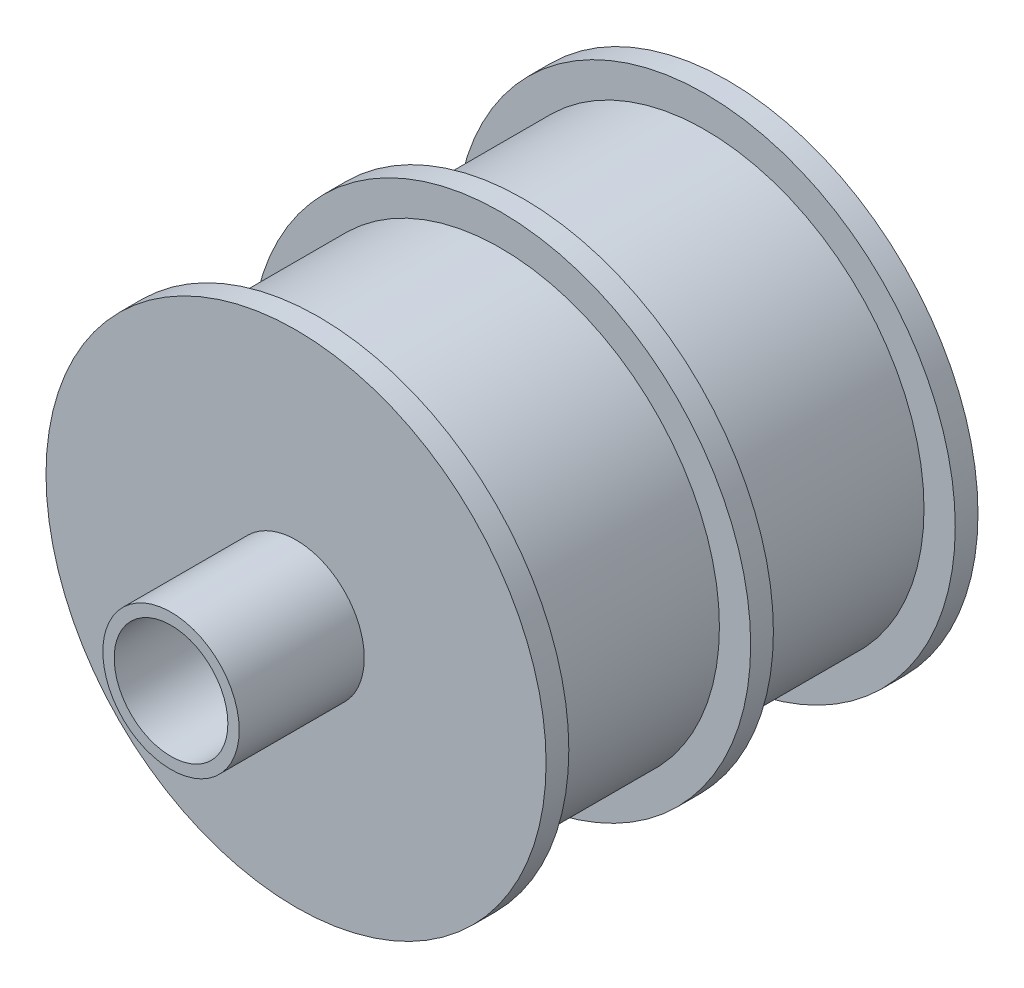
ISO-10303-21;
HEADER;
FILE_DESCRIPTION(('STEP AP214'),'2;1');
FILE_NAME('part.step','',(''),(''),'','','');
FILE_SCHEMA(('AUTOMOTIVE_DESIGN { 1 0 10303 214 1 1 1 1 }'));
ENDSEC;
DATA;
#1=APPLICATION_CONTEXT('core data for automotive mechanical design processes');
#2=APPLICATION_PROTOCOL_DEFINITION('international standard','automotive_design',2000,#1);
#3=PRODUCT_CONTEXT('',#1,'mechanical');
#4=PRODUCT('Part','Part','',(#3));
#5=PRODUCT_RELATED_PRODUCT_CATEGORY('part','',(#4));
#6=PRODUCT_DEFINITION_FORMATION('','',#4);
#7=PRODUCT_DEFINITION_CONTEXT('part definition',#1,'design');
#8=PRODUCT_DEFINITION('design','',#6,#7);
#9=PRODUCT_DEFINITION_SHAPE('','',#8);
#10=(LENGTH_UNIT() NAMED_UNIT(*) SI_UNIT(.MILLI.,.METRE.));
#11=(NAMED_UNIT(*) PLANE_ANGLE_UNIT() SI_UNIT($,.RADIAN.));
#12=(NAMED_UNIT(*) SI_UNIT($,.STERADIAN.) SOLID_ANGLE_UNIT());
#13=UNCERTAINTY_MEASURE_WITH_UNIT(LENGTH_MEASURE(1.E-05),#10,'distance_accuracy_value','');
#14=(GEOMETRIC_REPRESENTATION_CONTEXT(3) GLOBAL_UNCERTAINTY_ASSIGNED_CONTEXT((#13)) GLOBAL_UNIT_ASSIGNED_CONTEXT((#10,
#11,#12)) REPRESENTATION_CONTEXT('',''));
#15=CARTESIAN_POINT('',(0.,0.,0.));
#16=DIRECTION('',(0.,0.,1.));
#17=DIRECTION('',(1.,0.,0.));
#18=AXIS2_PLACEMENT_3D('',#15,#16,#17);
#19=CARTESIAN_POINT('',(0.,0.,49.));
#20=DIRECTION('',(0.,0.,1.));
#21=DIRECTION('',(1.,0.,0.));
#22=AXIS2_PLACEMENT_3D('',#19,#20,#21);
#23=PLANE('',#22);
#24=CARTESIAN_POINT('',(0.,0.,49.));
#25=DIRECTION('',(0.,0.,1.));
#26=DIRECTION('',(1.,0.,0.));
#27=AXIS2_PLACEMENT_3D('',#24,#25,#26);
#28=CIRCLE('',#27,5.);
#29=CARTESIAN_POINT('',(5.,0.,49.));
#30=VERTEX_POINT('',#29);
#31=EDGE_CURVE('P0_E20',#30,#30,#28,.T.);
#32=ORIENTED_EDGE('',*,*,#31,.F.);
#33=EDGE_LOOP('',(#32));
#34=FACE_BOUND('',#33,.T.);
#35=CARTESIAN_POINT('',(0.,0.,49.));
#36=DIRECTION('',(0.,0.,-1.));
#37=DIRECTION('',(1.,0.,0.));
#38=AXIS2_PLACEMENT_3D('',#35,#36,#37);
#39=CIRCLE('',#38,6.);
#40=CARTESIAN_POINT('',(6.,0.,49.));
#41=VERTEX_POINT('',#40);
#42=EDGE_CURVE('P0_E27',#41,#41,#39,.T.);
#43=ORIENTED_EDGE('',*,*,#42,.F.);
#44=EDGE_LOOP('',(#43));
#45=FACE_BOUND('',#44,.T.);
#46=ADVANCED_FACE('P0_F16',(#34,#45),#23,.T.);
#47=CARTESIAN_POINT('',(0.,0.,-11.));
#48=DIRECTION('',(0.,0.,-1.));
#49=DIRECTION('',(0.,-1.,0.));
#50=AXIS2_PLACEMENT_3D('',#47,#48,#49);
#51=PLANE('',#50);
#52=CARTESIAN_POINT('',(0.,0.,-11.));
#53=DIRECTION('',(0.,0.,1.));
#54=DIRECTION('',(1.,0.,0.));
#55=AXIS2_PLACEMENT_3D('',#52,#53,#54);
#56=CIRCLE('',#55,5.);
#57=CARTESIAN_POINT('',(5.,0.,-11.));
#58=VERTEX_POINT('',#57);
#59=EDGE_CURVE('P0_E11',#58,#58,#56,.T.);
#60=ORIENTED_EDGE('',*,*,#59,.T.);
#61=EDGE_LOOP('',(#60));
#62=FACE_BOUND('',#61,.T.);
#63=CARTESIAN_POINT('',(0.,0.,-11.));
#64=DIRECTION('',(0.,0.,1.));
#65=DIRECTION('',(1.,0.,0.));
#66=AXIS2_PLACEMENT_3D('',#63,#64,#65);
#67=CIRCLE('',#66,6.);
#68=CARTESIAN_POINT('',(6.,0.,-11.));
#69=VERTEX_POINT('',#68);
#70=EDGE_CURVE('P0_E48',#69,#69,#67,.T.);
#71=ORIENTED_EDGE('',*,*,#70,.F.);
#72=EDGE_LOOP('',(#71));
#73=FACE_BOUND('',#72,.T.);
#74=ADVANCED_FACE('P0_F49',(#62,#73),#51,.T.);
#75=CARTESIAN_POINT('',(0.,0.,-11.));
#76=DIRECTION('',(0.,0.,1.));
#77=DIRECTION('',(1.,0.,0.));
#78=AXIS2_PLACEMENT_3D('',#75,#76,#77);
#79=CYLINDRICAL_SURFACE('',#78,6.);
#80=ORIENTED_EDGE('',*,*,#42,.T.);
#81=EDGE_LOOP('',(#80));
#82=FACE_BOUND('',#81,.T.);
#83=ORIENTED_EDGE('',*,*,#70,.T.);
#84=EDGE_LOOP('',(#83));
#85=FACE_BOUND('',#84,.T.);
#86=ADVANCED_FACE('P0_F18',(#82,#85),#79,.T.);
#87=CARTESIAN_POINT('',(0.,0.,-11.));
#88=DIRECTION('',(0.,0.,1.));
#89=DIRECTION('',(1.,0.,0.));
#90=AXIS2_PLACEMENT_3D('',#87,#88,#89);
#91=CYLINDRICAL_SURFACE('',#90,5.);
#92=ORIENTED_EDGE('',*,*,#31,.T.);
#93=EDGE_LOOP('',(#92));
#94=FACE_BOUND('',#93,.T.);
#95=ORIENTED_EDGE('',*,*,#59,.F.);
#96=EDGE_LOOP('',(#95));
#97=FACE_BOUND('',#96,.T.);
#98=ADVANCED_FACE('P0_F63',(#94,#97),#91,.F.);
#99=CLOSED_SHELL('',(#46,#74,#86,#98));
#100=MANIFOLD_SOLID_BREP('P0_B1',#99);
#101=CARTESIAN_POINT('',(0.,0.,0.));
#102=DIRECTION('',(0.,0.,1.));
#103=DIRECTION('',(1.,0.,0.));
#104=AXIS2_PLACEMENT_3D('',#101,#102,#103);
#105=CYLINDRICAL_SURFACE('',#104,22.);
#106=CARTESIAN_POINT('',(0.,0.,38.));
#107=DIRECTION('',(0.,0.,-1.));
#108=DIRECTION('',(1.,0.,0.));
#109=AXIS2_PLACEMENT_3D('',#106,#107,#108);
#110=CIRCLE('',#109,22.);
#111=CARTESIAN_POINT('',(22.,0.,38.));
#112=VERTEX_POINT('',#111);
#113=EDGE_CURVE('P1_E11',#112,#112,#110,.T.);
#114=ORIENTED_EDGE('',*,*,#113,.T.);
#115=EDGE_LOOP('',(#114));
#116=FACE_BOUND('',#115,.T.);
#117=CARTESIAN_POINT('',(0.,0.,36.));
#118=DIRECTION('',(0.,0.,-1.));
#119=DIRECTION('',(1.,0.,0.));
#120=AXIS2_PLACEMENT_3D('',#117,#118,#119);
#121=CIRCLE('',#120,22.);
#122=CARTESIAN_POINT('',(22.,0.,36.));
#123=VERTEX_POINT('',#122);
#124=EDGE_CURVE('P1_E112',#123,#123,#121,.T.);
#125=ORIENTED_EDGE('',*,*,#124,.F.);
#126=EDGE_LOOP('',(#125));
#127=FACE_BOUND('',#126,.T.);
#128=ADVANCED_FACE('P1_F16',(#116,#127),#105,.T.);
#129=CARTESIAN_POINT('',(0.,0.,0.));
#130=DIRECTION('',(0.,0.,1.));
#131=DIRECTION('',(1.,0.,0.));
#132=AXIS2_PLACEMENT_3D('',#129,#130,#131);
#133=CYLINDRICAL_SURFACE('',#132,22.);
#134=CARTESIAN_POINT('',(0.,0.,20.));
#135=DIRECTION('',(0.,0.,-1.));
#136=DIRECTION('',(1.,0.,0.));
#137=AXIS2_PLACEMENT_3D('',#134,#135,#136);
#138=CIRCLE('',#137,22.);
#139=CARTESIAN_POINT('',(22.,0.,20.));
#140=VERTEX_POINT('',#139);
#141=EDGE_CURVE('P1_E26',#140,#140,#138,.T.);
#142=ORIENTED_EDGE('',*,*,#141,.T.);
#143=EDGE_LOOP('',(#142));
#144=FACE_BOUND('',#143,.T.);
#145=CARTESIAN_POINT('',(0.,0.,18.));
#146=DIRECTION('',(0.,0.,-1.));
#147=DIRECTION('',(1.,0.,0.));
#148=AXIS2_PLACEMENT_3D('',#145,#146,#147);
#149=CIRCLE('',#148,22.);
#150=CARTESIAN_POINT('',(22.,0.,18.));
#151=VERTEX_POINT('',#150);
#152=EDGE_CURVE('P1_E77',#151,#151,#149,.T.);
#153=ORIENTED_EDGE('',*,*,#152,.F.);
#154=EDGE_LOOP('',(#153));
#155=FACE_BOUND('',#154,.T.);
#156=ADVANCED_FACE('P1_F78',(#144,#155),#133,.T.);
#157=CARTESIAN_POINT('',(0.,0.,38.));
#158=DIRECTION('',(0.,0.,1.));
#159=DIRECTION('',(1.,0.,0.));
#160=AXIS2_PLACEMENT_3D('',#157,#158,#159);
#161=PLANE('',#160);
#162=CARTESIAN_POINT('',(0.,0.,38.));
#163=DIRECTION('',(0.,0.,-1.));
#164=DIRECTION('',(-1.,0.,0.));
#165=AXIS2_PLACEMENT_3D('',#162,#163,#164);
#166=CIRCLE('',#165,6.);
#167=CARTESIAN_POINT('',(-6.,0.,38.));
#168=VERTEX_POINT('',#167);
#169=EDGE_CURVE('P1_E96',#168,#168,#166,.T.);
#170=ORIENTED_EDGE('',*,*,#169,.T.);
#171=EDGE_LOOP('',(#170));
#172=FACE_BOUND('',#171,.T.);
#173=ORIENTED_EDGE('',*,*,#113,.F.);
#174=EDGE_LOOP('',(#173));
#175=FACE_BOUND('',#174,.T.);
#176=ADVANCED_FACE('P1_F138',(#172,#175),#161,.T.);
#177=CARTESIAN_POINT('',(0.,0.,0.));
#178=DIRECTION('',(0.,0.,-1.));
#179=DIRECTION('',(0.,-1.,0.));
#180=AXIS2_PLACEMENT_3D('',#177,#178,#179);
#181=PLANE('',#180);
#182=CARTESIAN_POINT('',(0.,0.,0.));
#183=DIRECTION('',(0.,0.,-1.));
#184=DIRECTION('',(-1.,0.,0.));
#185=AXIS2_PLACEMENT_3D('',#182,#183,#184);
#186=CIRCLE('',#185,6.);
#187=CARTESIAN_POINT('',(-6.,0.,0.));
#188=VERTEX_POINT('',#187);
#189=EDGE_CURVE('P1_E90',#188,#188,#186,.T.);
#190=ORIENTED_EDGE('',*,*,#189,.F.);
#191=EDGE_LOOP('',(#190));
#192=FACE_BOUND('',#191,.T.);
#193=CARTESIAN_POINT('',(0.,0.,0.));
#194=DIRECTION('',(0.,0.,1.));
#195=DIRECTION('',(1.,0.,0.));
#196=AXIS2_PLACEMENT_3D('',#193,#194,#195);
#197=CIRCLE('',#196,22.);
#198=CARTESIAN_POINT('',(22.,0.,0.));
#199=VERTEX_POINT('',#198);
#200=EDGE_CURVE('P1_E101',#199,#199,#197,.T.);
#201=ORIENTED_EDGE('',*,*,#200,.F.);
#202=EDGE_LOOP('',(#201));
#203=FACE_BOUND('',#202,.T.);
#204=ADVANCED_FACE('P1_F134',(#192,#203),#181,.T.);
#205=CARTESIAN_POINT('',(0.,0.,0.));
#206=DIRECTION('',(0.,0.,1.));
#207=DIRECTION('',(1.,0.,0.));
#208=AXIS2_PLACEMENT_3D('',#205,#206,#207);
#209=CYLINDRICAL_SURFACE('',#208,22.);
#210=CARTESIAN_POINT('',(0.,0.,2.));
#211=DIRECTION('',(0.,0.,-1.));
#212=DIRECTION('',(1.,0.,0.));
#213=AXIS2_PLACEMENT_3D('',#210,#211,#212);
#214=CIRCLE('',#213,22.);
#215=CARTESIAN_POINT('',(22.,0.,2.));
#216=VERTEX_POINT('',#215);
#217=EDGE_CURVE('P1_E105',#216,#216,#214,.T.);
#218=ORIENTED_EDGE('',*,*,#217,.T.);
#219=EDGE_LOOP('',(#218));
#220=FACE_BOUND('',#219,.T.);
#221=ORIENTED_EDGE('',*,*,#200,.T.);
#222=EDGE_LOOP('',(#221));
#223=FACE_BOUND('',#222,.T.);
#224=ADVANCED_FACE('P1_F137',(#220,#223),#209,.T.);
#225=CARTESIAN_POINT('',(0.,0.,38.));
#226=DIRECTION('',(0.,0.,-1.));
#227=DIRECTION('',(-1.,0.,0.));
#228=AXIS2_PLACEMENT_3D('',#225,#226,#227);
#229=CYLINDRICAL_SURFACE('',#228,6.);
#230=ORIENTED_EDGE('',*,*,#189,.T.);
#231=EDGE_LOOP('',(#230));
#232=FACE_BOUND('',#231,.T.);
#233=ORIENTED_EDGE('',*,*,#169,.F.);
#234=EDGE_LOOP('',(#233));
#235=FACE_BOUND('',#234,.T.);
#236=ADVANCED_FACE('P1_F131',(#232,#235),#229,.F.);
#237=CARTESIAN_POINT('',(0.,0.,18.));
#238=DIRECTION('',(0.,0.,-1.));
#239=DIRECTION('',(-1.,0.,0.));
#240=AXIS2_PLACEMENT_3D('',#237,#238,#239);
#241=CYLINDRICAL_SURFACE('',#240,19.25);
#242=CARTESIAN_POINT('',(0.,0.,18.));
#243=DIRECTION('',(0.,0.,-1.));
#244=DIRECTION('',(1.,0.,0.));
#245=AXIS2_PLACEMENT_3D('',#242,#243,#244);
#246=CIRCLE('',#245,19.25);
#247=CARTESIAN_POINT('',(19.25,0.,18.));
#248=VERTEX_POINT('',#247);
#249=EDGE_CURVE('P1_E81',#248,#248,#246,.T.);
#250=ORIENTED_EDGE('',*,*,#249,.T.);
#251=EDGE_LOOP('',(#250));
#252=FACE_BOUND('',#251,.T.);
#253=CARTESIAN_POINT('',(0.,0.,2.));
#254=DIRECTION('',(0.,0.,-1.));
#255=DIRECTION('',(1.,0.,0.));
#256=AXIS2_PLACEMENT_3D('',#253,#254,#255);
#257=CIRCLE('',#256,19.25);
#258=CARTESIAN_POINT('',(19.25,0.,2.));
#259=VERTEX_POINT('',#258);
#260=EDGE_CURVE('P1_E82',#259,#259,#257,.T.);
#261=ORIENTED_EDGE('',*,*,#260,.F.);
#262=EDGE_LOOP('',(#261));
#263=FACE_BOUND('',#262,.T.);
#264=ADVANCED_FACE('P1_F148',(#252,#263),#241,.T.);
#265=CARTESIAN_POINT('',(0.,0.,18.));
#266=DIRECTION('',(0.,0.,-1.));
#267=DIRECTION('',(0.,-1.,0.));
#268=AXIS2_PLACEMENT_3D('',#265,#266,#267);
#269=PLANE('',#268);
#270=ORIENTED_EDGE('',*,*,#152,.T.);
#271=EDGE_LOOP('',(#270));
#272=FACE_BOUND('',#271,.T.);
#273=ORIENTED_EDGE('',*,*,#249,.F.);
#274=EDGE_LOOP('',(#273));
#275=FACE_BOUND('',#274,.T.);
#276=ADVANCED_FACE('P1_F165',(#272,#275),#269,.T.);
#277=CARTESIAN_POINT('',(0.,0.,2.));
#278=DIRECTION('',(0.,0.,-1.));
#279=DIRECTION('',(0.,-1.,0.));
#280=AXIS2_PLACEMENT_3D('',#277,#278,#279);
#281=PLANE('',#280);
#282=ORIENTED_EDGE('',*,*,#217,.F.);
#283=EDGE_LOOP('',(#282));
#284=FACE_BOUND('',#283,.T.);
#285=ORIENTED_EDGE('',*,*,#260,.T.);
#286=EDGE_LOOP('',(#285));
#287=FACE_BOUND('',#286,.T.);
#288=ADVANCED_FACE('P1_F162',(#284,#287),#281,.F.);
#289=CARTESIAN_POINT('',(0.,0.,20.));
#290=DIRECTION('',(0.,0.,1.));
#291=DIRECTION('',(1.,0.,0.));
#292=AXIS2_PLACEMENT_3D('',#289,#290,#291);
#293=CYLINDRICAL_SURFACE('',#292,19.25);
#294=CARTESIAN_POINT('',(0.,0.,20.));
#295=DIRECTION('',(0.,0.,-1.));
#296=DIRECTION('',(1.,0.,0.));
#297=AXIS2_PLACEMENT_3D('',#294,#295,#296);
#298=CIRCLE('',#297,19.25);
#299=CARTESIAN_POINT('',(19.25,0.,20.));
#300=VERTEX_POINT('',#299);
#301=EDGE_CURVE('P1_E109',#300,#300,#298,.T.);
#302=ORIENTED_EDGE('',*,*,#301,.F.);
#303=EDGE_LOOP('',(#302));
#304=FACE_BOUND('',#303,.T.);
#305=CARTESIAN_POINT('',(0.,0.,36.));
#306=DIRECTION('',(0.,0.,-1.));
#307=DIRECTION('',(1.,0.,0.));
#308=AXIS2_PLACEMENT_3D('',#305,#306,#307);
#309=CIRCLE('',#308,19.25);
#310=CARTESIAN_POINT('',(19.25,0.,36.));
#311=VERTEX_POINT('',#310);
#312=EDGE_CURVE('P1_E92',#311,#311,#309,.T.);
#313=ORIENTED_EDGE('',*,*,#312,.T.);
#314=EDGE_LOOP('',(#313));
#315=FACE_BOUND('',#314,.T.);
#316=ADVANCED_FACE('P1_F164',(#304,#315),#293,.T.);
#317=CARTESIAN_POINT('',(0.,0.,20.));
#318=DIRECTION('',(0.,0.,-1.));
#319=DIRECTION('',(0.,-1.,0.));
#320=AXIS2_PLACEMENT_3D('',#317,#318,#319);
#321=PLANE('',#320);
#322=ORIENTED_EDGE('',*,*,#141,.F.);
#323=EDGE_LOOP('',(#322));
#324=FACE_BOUND('',#323,.T.);
#325=ORIENTED_EDGE('',*,*,#301,.T.);
#326=EDGE_LOOP('',(#325));
#327=FACE_BOUND('',#326,.T.);
#328=ADVANCED_FACE('P1_F171',(#324,#327),#321,.F.);
#329=CARTESIAN_POINT('',(0.,0.,36.));
#330=DIRECTION('',(0.,0.,-1.));
#331=DIRECTION('',(0.,-1.,0.));
#332=AXIS2_PLACEMENT_3D('',#329,#330,#331);
#333=PLANE('',#332);
#334=ORIENTED_EDGE('',*,*,#124,.T.);
#335=EDGE_LOOP('',(#334));
#336=FACE_BOUND('',#335,.T.);
#337=ORIENTED_EDGE('',*,*,#312,.F.);
#338=EDGE_LOOP('',(#337));
#339=FACE_BOUND('',#338,.T.);
#340=ADVANCED_FACE('P1_F18',(#336,#339),#333,.T.);
#341=CLOSED_SHELL('',(#128,#156,#176,#204,#224,#236,#264,#276,#288,#316,#328,#340));
#342=MANIFOLD_SOLID_BREP('P1_B1',#341);
#343=ADVANCED_BREP_SHAPE_REPRESENTATION('',(#18,#100,#342),#14);
#344=SHAPE_DEFINITION_REPRESENTATION(#9,#343);
ENDSEC;
END-ISO-10303-21;
